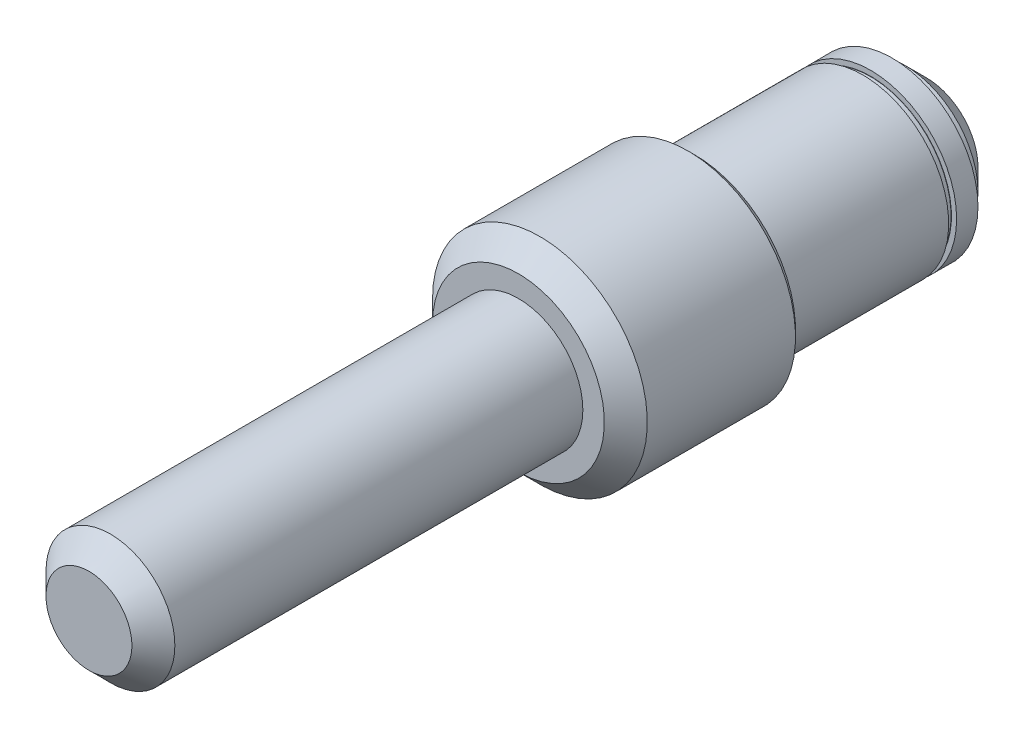
ISO-10303-21;
HEADER;
FILE_DESCRIPTION(('STEP AP214'),'2;1');
FILE_NAME('part.step','',(''),(''),'','','');
FILE_SCHEMA(('AUTOMOTIVE_DESIGN { 1 0 10303 214 1 1 1 1 }'));
ENDSEC;
DATA;
#1=APPLICATION_CONTEXT('core data for automotive mechanical design processes');
#2=APPLICATION_PROTOCOL_DEFINITION('international standard','automotive_design',2000,#1);
#3=PRODUCT_CONTEXT('',#1,'mechanical');
#4=PRODUCT('Part','Part','',(#3));
#5=PRODUCT_RELATED_PRODUCT_CATEGORY('part','',(#4));
#6=PRODUCT_DEFINITION_FORMATION('','',#4);
#7=PRODUCT_DEFINITION_CONTEXT('part definition',#1,'design');
#8=PRODUCT_DEFINITION('design','',#6,#7);
#9=PRODUCT_DEFINITION_SHAPE('','',#8);
#10=(LENGTH_UNIT() NAMED_UNIT(*) SI_UNIT(.MILLI.,.METRE.));
#11=(NAMED_UNIT(*) PLANE_ANGLE_UNIT() SI_UNIT($,.RADIAN.));
#12=(NAMED_UNIT(*) SI_UNIT($,.STERADIAN.) SOLID_ANGLE_UNIT());
#13=UNCERTAINTY_MEASURE_WITH_UNIT(LENGTH_MEASURE(1.E-05),#10,'distance_accuracy_value','');
#14=(GEOMETRIC_REPRESENTATION_CONTEXT(3) GLOBAL_UNCERTAINTY_ASSIGNED_CONTEXT((#13)) GLOBAL_UNIT_ASSIGNED_CONTEXT((#10,
#11,#12)) REPRESENTATION_CONTEXT('',''));
#15=CARTESIAN_POINT('',(0.,0.,0.));
#16=DIRECTION('',(0.,0.,1.));
#17=DIRECTION('',(1.,0.,0.));
#18=AXIS2_PLACEMENT_3D('',#15,#16,#17);
#19=CARTESIAN_POINT('',(0.,0.,0.));
#20=DIRECTION('',(0.,0.,1.));
#21=DIRECTION('',(1.,0.,0.));
#22=AXIS2_PLACEMENT_3D('',#19,#20,#21);
#23=CYLINDRICAL_SURFACE('',#22,20.);
#24=CARTESIAN_POINT('',(0.,0.,-180.175));
#25=DIRECTION('',(0.,0.,-1.));
#26=DIRECTION('',(-1.,0.,0.));
#27=AXIS2_PLACEMENT_3D('',#24,#25,#26);
#28=CIRCLE('',#27,20.);
#29=CARTESIAN_POINT('',(-20.,0.,-180.175));
#30=VERTEX_POINT('',#29);
#31=EDGE_CURVE('E215',#30,#30,#28,.T.);
#32=ORIENTED_EDGE('',*,*,#31,.F.);
#33=EDGE_LOOP('',(#32));
#34=FACE_BOUND('',#33,.T.);
#35=CARTESIAN_POINT('',(0.,0.,-141.));
#36=DIRECTION('',(0.,0.,-1.));
#37=DIRECTION('',(-1.,0.,0.));
#38=AXIS2_PLACEMENT_3D('',#35,#36,#37);
#39=CIRCLE('',#38,20.);
#40=CARTESIAN_POINT('',(-20.,0.,-141.));
#41=VERTEX_POINT('',#40);
#42=EDGE_CURVE('E214',#41,#41,#39,.T.);
#43=ORIENTED_EDGE('',*,*,#42,.T.);
#44=EDGE_LOOP('',(#43));
#45=FACE_BOUND('',#44,.T.);
#46=ADVANCED_FACE('F43',(#34,#45),#23,.T.);
#47=CARTESIAN_POINT('',(0.,0.,-180.175));
#48=DIRECTION('',(0.,0.,-1.));
#49=DIRECTION('',(-1.,0.,0.));
#50=AXIS2_PLACEMENT_3D('',#47,#48,#49);
#51=PLANE('',#50);
#52=CARTESIAN_POINT('',(0.,0.,-180.175));
#53=DIRECTION('',(0.,0.,-1.));
#54=DIRECTION('',(-1.,0.,0.));
#55=AXIS2_PLACEMENT_3D('',#52,#53,#54);
#56=CIRCLE('',#55,18.8);
#57=CARTESIAN_POINT('',(-18.8,0.,-180.175));
#58=VERTEX_POINT('',#57);
#59=EDGE_CURVE('E143',#58,#58,#56,.F.);
#60=ORIENTED_EDGE('',*,*,#59,.T.);
#61=EDGE_LOOP('',(#60));
#62=FACE_BOUND('',#61,.T.);
#63=ORIENTED_EDGE('',*,*,#31,.T.);
#64=EDGE_LOOP('',(#63));
#65=FACE_BOUND('',#64,.T.);
#66=ADVANCED_FACE('F73',(#62,#65),#51,.T.);
#67=CARTESIAN_POINT('',(0.,0.,-182.025));
#68=DIRECTION('',(0.,0.,-1.));
#69=DIRECTION('',(-1.,0.,0.));
#70=AXIS2_PLACEMENT_3D('',#67,#68,#69);
#71=PLANE('',#70);
#72=CARTESIAN_POINT('',(0.,0.,-182.025));
#73=DIRECTION('',(0.,0.,-1.));
#74=DIRECTION('',(-1.,0.,0.));
#75=AXIS2_PLACEMENT_3D('',#72,#73,#74);
#76=CIRCLE('',#75,18.8);
#77=CARTESIAN_POINT('',(-18.8,0.,-182.025));
#78=VERTEX_POINT('',#77);
#79=EDGE_CURVE('E149',#78,#78,#76,.T.);
#80=ORIENTED_EDGE('',*,*,#79,.T.);
#81=EDGE_LOOP('',(#80));
#82=FACE_BOUND('',#81,.T.);
#83=CARTESIAN_POINT('',(0.,0.,-182.025));
#84=DIRECTION('',(0.,0.,-1.));
#85=DIRECTION('',(-1.,0.,0.));
#86=AXIS2_PLACEMENT_3D('',#83,#84,#85);
#87=CIRCLE('',#86,20.);
#88=CARTESIAN_POINT('',(-20.,0.,-182.025));
#89=VERTEX_POINT('',#88);
#90=EDGE_CURVE('E108',#89,#89,#87,.T.);
#91=ORIENTED_EDGE('',*,*,#90,.F.);
#92=EDGE_LOOP('',(#91));
#93=FACE_BOUND('',#92,.T.);
#94=ADVANCED_FACE('F68',(#82,#93),#71,.F.);
#95=CARTESIAN_POINT('',(0.,0.,-180.175));
#96=DIRECTION('',(0.,0.,-1.));
#97=DIRECTION('',(-1.,0.,0.));
#98=AXIS2_PLACEMENT_3D('',#95,#96,#97);
#99=CYLINDRICAL_SURFACE('',#98,18.75);
#100=CARTESIAN_POINT('',(0.,0.,-180.225));
#101=DIRECTION('',(0.,0.,-1.));
#102=DIRECTION('',(-1.,0.,0.));
#103=AXIS2_PLACEMENT_3D('',#100,#101,#102);
#104=CIRCLE('',#103,18.75);
#105=CARTESIAN_POINT('',(-18.75,0.,-180.225));
#106=VERTEX_POINT('',#105);
#107=EDGE_CURVE('E144',#106,#106,#104,.T.);
#108=ORIENTED_EDGE('',*,*,#107,.T.);
#109=EDGE_LOOP('',(#108));
#110=FACE_BOUND('',#109,.T.);
#111=CARTESIAN_POINT('',(0.,0.,-181.975));
#112=DIRECTION('',(0.,0.,-1.));
#113=DIRECTION('',(-1.,0.,0.));
#114=AXIS2_PLACEMENT_3D('',#111,#112,#113);
#115=CIRCLE('',#114,18.75);
#116=CARTESIAN_POINT('',(-18.75,0.,-181.975));
#117=VERTEX_POINT('',#116);
#118=EDGE_CURVE('E139',#117,#117,#115,.F.);
#119=ORIENTED_EDGE('',*,*,#118,.T.);
#120=EDGE_LOOP('',(#119));
#121=FACE_BOUND('',#120,.T.);
#122=ADVANCED_FACE('F60',(#110,#121),#99,.T.);
#123=CARTESIAN_POINT('',(0.,0.,-190.));
#124=DIRECTION('',(0.,0.,-1.));
#125=DIRECTION('',(-1.,0.,0.));
#126=AXIS2_PLACEMENT_3D('',#123,#124,#125);
#127=CONICAL_SURFACE('',#126,0.,0.785398163397451);
#128=CARTESIAN_POINT('',(0.,0.,-195.));
#129=DIRECTION('',(0.,0.,1.));
#130=DIRECTION('',(1.,0.,0.));
#131=AXIS2_PLACEMENT_3D('',#128,#129,#130);
#132=CIRCLE('',#131,5.);
#133=CARTESIAN_POINT('',(5.,0.,-195.));
#134=VERTEX_POINT('',#133);
#135=EDGE_CURVE('E120',#134,#134,#132,.T.);
#136=ORIENTED_EDGE('',*,*,#135,.F.);
#137=EDGE_LOOP('',(#136));
#138=FACE_BOUND('',#137,.T.);
#139=CARTESIAN_POINT('',(0.,0.,-190.));
#140=VERTEX_POINT('',#139);
#141=VERTEX_LOOP('',#140);
#142=FACE_BOUND('',#141,.T.);
#143=ADVANCED_FACE('F53',(#138,#142),#127,.F.);
#144=CARTESIAN_POINT('',(0.,17.,-195.));
#145=DIRECTION('',(0.,0.,1.));
#146=DIRECTION('',(1.,0.,0.));
#147=AXIS2_PLACEMENT_3D('',#144,#145,#146);
#148=PLANE('',#147);
#149=CARTESIAN_POINT('',(0.,0.,-195.));
#150=DIRECTION('',(0.,0.,1.));
#151=DIRECTION('',(1.,0.,0.));
#152=AXIS2_PLACEMENT_3D('',#149,#150,#151);
#153=CIRCLE('',#152,12.);
#154=CARTESIAN_POINT('',(12.,0.,-195.));
#155=VERTEX_POINT('',#154);
#156=EDGE_CURVE('E133',#155,#155,#153,.F.);
#157=ORIENTED_EDGE('',*,*,#156,.T.);
#158=EDGE_LOOP('',(#157));
#159=FACE_BOUND('',#158,.T.);
#160=ORIENTED_EDGE('',*,*,#135,.T.);
#161=EDGE_LOOP('',(#160));
#162=FACE_BOUND('',#161,.T.);
#163=ADVANCED_FACE('F57',(#159,#162),#148,.F.);
#164=CARTESIAN_POINT('',(0.,0.,-190.));
#165=DIRECTION('',(0.,0.,1.));
#166=DIRECTION('',(1.,0.,0.));
#167=AXIS2_PLACEMENT_3D('',#164,#165,#166);
#168=CONICAL_SURFACE('',#167,17.,0.785398163397452);
#169=ORIENTED_EDGE('',*,*,#156,.F.);
#170=EDGE_LOOP('',(#169));
#171=FACE_BOUND('',#170,.T.);
#172=CARTESIAN_POINT('',(0.,0.,-190.));
#173=DIRECTION('',(0.,0.,1.));
#174=DIRECTION('',(1.,0.,0.));
#175=AXIS2_PLACEMENT_3D('',#172,#173,#174);
#176=CIRCLE('',#175,17.);
#177=CARTESIAN_POINT('',(17.,0.,-190.));
#178=VERTEX_POINT('',#177);
#179=EDGE_CURVE('E135',#178,#178,#176,.T.);
#180=ORIENTED_EDGE('',*,*,#179,.F.);
#181=EDGE_LOOP('',(#180));
#182=FACE_BOUND('',#181,.T.);
#183=ADVANCED_FACE('F63',(#171,#182),#168,.T.);
#184=CARTESIAN_POINT('',(0.,0.,0.));
#185=DIRECTION('',(0.,0.,1.));
#186=DIRECTION('',(1.,0.,0.));
#187=AXIS2_PLACEMENT_3D('',#184,#185,#186);
#188=CYLINDRICAL_SURFACE('',#187,17.);
#189=ORIENTED_EDGE('',*,*,#179,.T.);
#190=EDGE_LOOP('',(#189));
#191=FACE_BOUND('',#190,.T.);
#192=CARTESIAN_POINT('',(0.,0.,-187.));
#193=DIRECTION('',(0.,0.,1.));
#194=DIRECTION('',(1.,0.,0.));
#195=AXIS2_PLACEMENT_3D('',#192,#193,#194);
#196=CIRCLE('',#195,17.);
#197=CARTESIAN_POINT('',(17.,0.,-187.));
#198=VERTEX_POINT('',#197);
#199=EDGE_CURVE('E113',#198,#198,#196,.T.);
#200=ORIENTED_EDGE('',*,*,#199,.F.);
#201=EDGE_LOOP('',(#200));
#202=FACE_BOUND('',#201,.T.);
#203=ADVANCED_FACE('F102',(#191,#202),#188,.T.);
#204=CARTESIAN_POINT('',(0.,20.,-187.));
#205=DIRECTION('',(0.,0.,1.));
#206=DIRECTION('',(1.,0.,0.));
#207=AXIS2_PLACEMENT_3D('',#204,#205,#206);
#208=PLANE('',#207);
#209=CARTESIAN_POINT('',(0.,0.,-187.));
#210=DIRECTION('',(0.,0.,1.));
#211=DIRECTION('',(1.,0.,0.));
#212=AXIS2_PLACEMENT_3D('',#209,#210,#211);
#213=CIRCLE('',#212,20.);
#214=CARTESIAN_POINT('',(20.,0.,-187.));
#215=VERTEX_POINT('',#214);
#216=EDGE_CURVE('E110',#215,#215,#213,.T.);
#217=ORIENTED_EDGE('',*,*,#216,.F.);
#218=EDGE_LOOP('',(#217));
#219=FACE_BOUND('',#218,.T.);
#220=ORIENTED_EDGE('',*,*,#199,.T.);
#221=EDGE_LOOP('',(#220));
#222=FACE_BOUND('',#221,.T.);
#223=ADVANCED_FACE('F91',(#219,#222),#208,.F.);
#224=ORIENTED_EDGE('',*,*,#90,.T.);
#225=EDGE_LOOP('',(#224));
#226=FACE_BOUND('',#225,.T.);
#227=ORIENTED_EDGE('',*,*,#216,.T.);
#228=EDGE_LOOP('',(#227));
#229=FACE_BOUND('',#228,.T.);
#230=ADVANCED_FACE('F78',(#226,#229),#23,.T.);
#231=CARTESIAN_POINT('',(0.,0.,-180.225));
#232=DIRECTION('',(0.,0.,-1.));
#233=DIRECTION('',(-1.,0.,0.));
#234=AXIS2_PLACEMENT_3D('',#231,#232,#233);
#235=TOROIDAL_SURFACE('',#234,18.8,0.05);
#236=ORIENTED_EDGE('',*,*,#59,.F.);
#237=EDGE_LOOP('',(#236));
#238=FACE_BOUND('',#237,.T.);
#239=ORIENTED_EDGE('',*,*,#107,.F.);
#240=EDGE_LOOP('',(#239));
#241=FACE_BOUND('',#240,.T.);
#242=ADVANCED_FACE('F94',(#238,#241),#235,.F.);
#243=CARTESIAN_POINT('',(0.,0.,-181.975));
#244=DIRECTION('',(0.,0.,-1.));
#245=DIRECTION('',(-1.,0.,0.));
#246=AXIS2_PLACEMENT_3D('',#243,#244,#245);
#247=TOROIDAL_SURFACE('',#246,18.8,0.05);
#248=ORIENTED_EDGE('',*,*,#118,.F.);
#249=EDGE_LOOP('',(#248));
#250=FACE_BOUND('',#249,.T.);
#251=ORIENTED_EDGE('',*,*,#79,.F.);
#252=EDGE_LOOP('',(#251));
#253=FACE_BOUND('',#252,.T.);
#254=ADVANCED_FACE('F100',(#250,#253),#247,.F.);
#255=CARTESIAN_POINT('',(0.,0.,-141.));
#256=DIRECTION('',(0.,0.,-1.));
#257=DIRECTION('',(-1.,0.,0.));
#258=AXIS2_PLACEMENT_3D('',#255,#256,#257);
#259=PLANE('',#258);
#260=CARTESIAN_POINT('',(0.,0.,-141.));
#261=DIRECTION('',(0.,0.,-1.));
#262=DIRECTION('',(-1.,0.,0.));
#263=AXIS2_PLACEMENT_3D('',#260,#261,#262);
#264=CIRCLE('',#263,23.5);
#265=CARTESIAN_POINT('',(-23.5,0.,-141.));
#266=VERTEX_POINT('',#265);
#267=EDGE_CURVE('E51',#266,#266,#264,.T.);
#268=ORIENTED_EDGE('',*,*,#267,.T.);
#269=EDGE_LOOP('',(#268));
#270=FACE_BOUND('',#269,.T.);
#271=ORIENTED_EDGE('',*,*,#42,.F.);
#272=EDGE_LOOP('',(#271));
#273=FACE_BOUND('',#272,.T.);
#274=ADVANCED_FACE('F155',(#270,#273),#259,.T.);
#275=CARTESIAN_POINT('',(0.,0.,0.));
#276=DIRECTION('',(0.,0.,-1.));
#277=DIRECTION('',(-1.,0.,0.));
#278=AXIS2_PLACEMENT_3D('',#275,#276,#277);
#279=PLANE('',#278);
#280=CARTESIAN_POINT('',(0.,0.,0.));
#281=DIRECTION('',(0.,0.,-1.));
#282=DIRECTION('',(-1.,0.,0.));
#283=AXIS2_PLACEMENT_3D('',#280,#281,#282);
#284=CIRCLE('',#283,10.);
#285=CARTESIAN_POINT('',(-10.,0.,0.));
#286=VERTEX_POINT('',#285);
#287=EDGE_CURVE('E126',#286,#286,#284,.F.);
#288=ORIENTED_EDGE('',*,*,#287,.T.);
#289=EDGE_LOOP('',(#288));
#290=FACE_BOUND('',#289,.T.);
#291=ADVANCED_FACE('F188',(#290),#279,.F.);
#292=CARTESIAN_POINT('',(0.,0.,0.));
#293=DIRECTION('',(0.,0.,-1.));
#294=DIRECTION('',(-1.,0.,0.));
#295=AXIS2_PLACEMENT_3D('',#292,#293,#294);
#296=CONICAL_SURFACE('',#295,10.,0.785398163397446);
#297=CARTESIAN_POINT('',(0.,0.,-5.00000000000002));
#298=DIRECTION('',(0.,0.,-1.));
#299=DIRECTION('',(-1.,0.,0.));
#300=AXIS2_PLACEMENT_3D('',#297,#298,#299);
#301=CIRCLE('',#300,15.);
#302=CARTESIAN_POINT('',(-15.,0.,-5.00000000000002));
#303=VERTEX_POINT('',#302);
#304=EDGE_CURVE('E128',#303,#303,#301,.T.);
#305=ORIENTED_EDGE('',*,*,#304,.F.);
#306=EDGE_LOOP('',(#305));
#307=FACE_BOUND('',#306,.T.);
#308=ORIENTED_EDGE('',*,*,#287,.F.);
#309=EDGE_LOOP('',(#308));
#310=FACE_BOUND('',#309,.T.);
#311=ADVANCED_FACE('F176',(#307,#310),#296,.T.);
#312=CARTESIAN_POINT('',(0.,0.,0.));
#313=DIRECTION('',(0.,0.,1.));
#314=DIRECTION('',(1.,0.,0.));
#315=AXIS2_PLACEMENT_3D('',#312,#313,#314);
#316=CYLINDRICAL_SURFACE('',#315,15.);
#317=ORIENTED_EDGE('',*,*,#304,.T.);
#318=EDGE_LOOP('',(#317));
#319=FACE_BOUND('',#318,.T.);
#320=CARTESIAN_POINT('',(0.,0.,-100.));
#321=DIRECTION('',(0.,0.,1.));
#322=DIRECTION('',(1.,0.,0.));
#323=AXIS2_PLACEMENT_3D('',#320,#321,#322);
#324=CIRCLE('',#323,15.);
#325=CARTESIAN_POINT('',(15.,0.,-100.));
#326=VERTEX_POINT('',#325);
#327=EDGE_CURVE('E109',#326,#326,#324,.T.);
#328=ORIENTED_EDGE('',*,*,#327,.T.);
#329=EDGE_LOOP('',(#328));
#330=FACE_BOUND('',#329,.T.);
#331=ADVANCED_FACE('F173',(#319,#330),#316,.T.);
#332=CARTESIAN_POINT('',(0.,15.,-100.));
#333=DIRECTION('',(0.,0.,-1.));
#334=DIRECTION('',(-1.,0.,0.));
#335=AXIS2_PLACEMENT_3D('',#332,#333,#334);
#336=PLANE('',#335);
#337=CARTESIAN_POINT('',(0.,0.,-100.));
#338=DIRECTION('',(0.,0.,-1.));
#339=DIRECTION('',(-1.,0.,0.));
#340=AXIS2_PLACEMENT_3D('',#337,#338,#339);
#341=CIRCLE('',#340,20.);
#342=CARTESIAN_POINT('',(-20.,0.,-100.));
#343=VERTEX_POINT('',#342);
#344=EDGE_CURVE('E114',#343,#343,#341,.F.);
#345=ORIENTED_EDGE('',*,*,#344,.T.);
#346=EDGE_LOOP('',(#345));
#347=FACE_BOUND('',#346,.T.);
#348=ORIENTED_EDGE('',*,*,#327,.F.);
#349=EDGE_LOOP('',(#348));
#350=FACE_BOUND('',#349,.T.);
#351=ADVANCED_FACE('F168',(#347,#350),#336,.F.);
#352=CARTESIAN_POINT('',(0.,0.,-100.));
#353=DIRECTION('',(0.,0.,-1.));
#354=DIRECTION('',(-1.,0.,0.));
#355=AXIS2_PLACEMENT_3D('',#352,#353,#354);
#356=CONICAL_SURFACE('',#355,20.,0.785398163397445);
#357=CARTESIAN_POINT('',(0.,0.,-105.));
#358=DIRECTION('',(0.,0.,-1.));
#359=DIRECTION('',(-1.,0.,0.));
#360=AXIS2_PLACEMENT_3D('',#357,#358,#359);
#361=CIRCLE('',#360,25.);
#362=CARTESIAN_POINT('',(-25.,0.,-105.));
#363=VERTEX_POINT('',#362);
#364=EDGE_CURVE('E123',#363,#363,#361,.T.);
#365=ORIENTED_EDGE('',*,*,#364,.F.);
#366=EDGE_LOOP('',(#365));
#367=FACE_BOUND('',#366,.T.);
#368=ORIENTED_EDGE('',*,*,#344,.F.);
#369=EDGE_LOOP('',(#368));
#370=FACE_BOUND('',#369,.T.);
#371=ADVANCED_FACE('F162',(#367,#370),#356,.T.);
#372=CARTESIAN_POINT('',(0.,0.,0.));
#373=DIRECTION('',(0.,0.,1.));
#374=DIRECTION('',(1.,0.,0.));
#375=AXIS2_PLACEMENT_3D('',#372,#373,#374);
#376=CYLINDRICAL_SURFACE('',#375,25.);
#377=CARTESIAN_POINT('',(0.,0.,-139.5));
#378=DIRECTION('',(0.,0.,-1.));
#379=DIRECTION('',(-1.,0.,0.));
#380=AXIS2_PLACEMENT_3D('',#377,#378,#379);
#381=CIRCLE('',#380,25.);
#382=CARTESIAN_POINT('',(-25.,0.,-139.5));
#383=VERTEX_POINT('',#382);
#384=EDGE_CURVE('E11',#383,#383,#381,.F.);
#385=ORIENTED_EDGE('',*,*,#384,.T.);
#386=EDGE_LOOP('',(#385));
#387=FACE_BOUND('',#386,.T.);
#388=ORIENTED_EDGE('',*,*,#364,.T.);
#389=EDGE_LOOP('',(#388));
#390=FACE_BOUND('',#389,.T.);
#391=ADVANCED_FACE('F157',(#387,#390),#376,.T.);
#392=CARTESIAN_POINT('',(0.,0.,-141.));
#393=DIRECTION('',(0.,0.,1.));
#394=DIRECTION('',(1.,0.,0.));
#395=AXIS2_PLACEMENT_3D('',#392,#393,#394);
#396=CONICAL_SURFACE('',#395,23.5,0.78539816339745);
#397=ORIENTED_EDGE('',*,*,#384,.F.);
#398=EDGE_LOOP('',(#397));
#399=FACE_BOUND('',#398,.T.);
#400=ORIENTED_EDGE('',*,*,#267,.F.);
#401=EDGE_LOOP('',(#400));
#402=FACE_BOUND('',#401,.T.);
#403=ADVANCED_FACE('F46',(#399,#402),#396,.T.);
#404=CLOSED_SHELL('',(#46,#66,#94,#122,#143,#163,#183,#203,#223,#230,#242,#254,#274,#291,#311,
#331,#351,#371,#391,#403));
#405=MANIFOLD_SOLID_BREP('B2',#404);
#406=ADVANCED_BREP_SHAPE_REPRESENTATION('',(#18,#405),#14);
#407=SHAPE_DEFINITION_REPRESENTATION(#9,#406);
ENDSEC;
END-ISO-10303-21;
